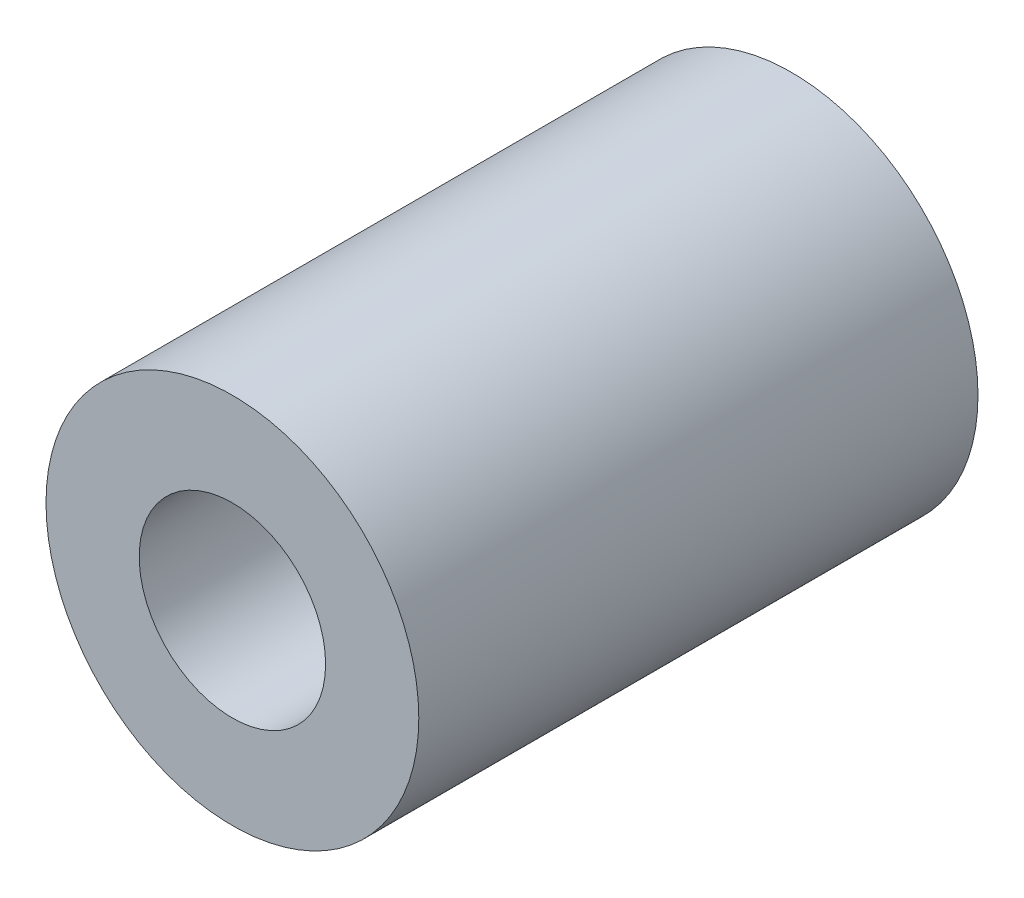
ISO-10303-21;
HEADER;
FILE_DESCRIPTION(('STEP AP214'),'2;1');
FILE_NAME('part.step','',(''),(''),'','','');
FILE_SCHEMA(('AUTOMOTIVE_DESIGN { 1 0 10303 214 1 1 1 1 }'));
ENDSEC;
DATA;
#1=APPLICATION_CONTEXT('core data for automotive mechanical design processes');
#2=APPLICATION_PROTOCOL_DEFINITION('international standard','automotive_design',2000,#1);
#3=PRODUCT_CONTEXT('',#1,'mechanical');
#4=PRODUCT('Part','Part','',(#3));
#5=PRODUCT_RELATED_PRODUCT_CATEGORY('part','',(#4));
#6=PRODUCT_DEFINITION_FORMATION('','',#4);
#7=PRODUCT_DEFINITION_CONTEXT('part definition',#1,'design');
#8=PRODUCT_DEFINITION('design','',#6,#7);
#9=PRODUCT_DEFINITION_SHAPE('','',#8);
#10=(LENGTH_UNIT() NAMED_UNIT(*) SI_UNIT(.MILLI.,.METRE.));
#11=(NAMED_UNIT(*) PLANE_ANGLE_UNIT() SI_UNIT($,.RADIAN.));
#12=(NAMED_UNIT(*) SI_UNIT($,.STERADIAN.) SOLID_ANGLE_UNIT());
#13=UNCERTAINTY_MEASURE_WITH_UNIT(LENGTH_MEASURE(1.E-05),#10,'distance_accuracy_value','');
#14=(GEOMETRIC_REPRESENTATION_CONTEXT(3) GLOBAL_UNCERTAINTY_ASSIGNED_CONTEXT((#13)) GLOBAL_UNIT_ASSIGNED_CONTEXT((#10,
#11,#12)) REPRESENTATION_CONTEXT('',''));
#15=CARTESIAN_POINT('',(0.,0.,0.));
#16=DIRECTION('',(0.,0.,1.));
#17=DIRECTION('',(1.,0.,0.));
#18=AXIS2_PLACEMENT_3D('',#15,#16,#17);
#19=CARTESIAN_POINT('',(0.,0.,9.));
#20=DIRECTION('',(0.,0.,1.));
#21=DIRECTION('',(1.,0.,0.));
#22=AXIS2_PLACEMENT_3D('',#19,#20,#21);
#23=PLANE('',#22);
#24=CARTESIAN_POINT('',(0.,0.,9.));
#25=DIRECTION('',(0.,0.,1.));
#26=DIRECTION('',(1.,0.,0.));
#27=AXIS2_PLACEMENT_3D('',#24,#25,#26);
#28=CIRCLE('',#27,3.);
#29=CARTESIAN_POINT('',(3.,0.,9.));
#30=VERTEX_POINT('',#29);
#31=EDGE_CURVE('E10',#30,#30,#28,.T.);
#32=ORIENTED_EDGE('',*,*,#31,.T.);
#33=EDGE_LOOP('',(#32));
#34=FACE_BOUND('',#33,.T.);
#35=CARTESIAN_POINT('',(0.,0.,9.));
#36=DIRECTION('',(0.,0.,1.));
#37=DIRECTION('',(1.,0.,0.));
#38=AXIS2_PLACEMENT_3D('',#35,#36,#37);
#39=CIRCLE('',#38,1.5);
#40=CARTESIAN_POINT('',(1.5,0.,9.));
#41=VERTEX_POINT('',#40);
#42=EDGE_CURVE('E54',#41,#41,#39,.T.);
#43=ORIENTED_EDGE('',*,*,#42,.F.);
#44=EDGE_LOOP('',(#43));
#45=FACE_BOUND('',#44,.T.);
#46=ADVANCED_FACE('F41',(#34,#45),#23,.T.);
#47=CARTESIAN_POINT('',(0.,0.,0.));
#48=DIRECTION('',(0.,0.,1.));
#49=DIRECTION('',(1.,0.,0.));
#50=AXIS2_PLACEMENT_3D('',#47,#48,#49);
#51=PLANE('',#50);
#52=CARTESIAN_POINT('',(0.,0.,0.));
#53=DIRECTION('',(0.,0.,1.));
#54=DIRECTION('',(1.,0.,0.));
#55=AXIS2_PLACEMENT_3D('',#52,#53,#54);
#56=CIRCLE('',#55,3.);
#57=CARTESIAN_POINT('',(3.,0.,0.));
#58=VERTEX_POINT('',#57);
#59=EDGE_CURVE('E45',#58,#58,#56,.T.);
#60=ORIENTED_EDGE('',*,*,#59,.F.);
#61=EDGE_LOOP('',(#60));
#62=FACE_BOUND('',#61,.T.);
#63=CARTESIAN_POINT('',(0.,0.,0.));
#64=DIRECTION('',(0.,0.,1.));
#65=DIRECTION('',(1.,0.,0.));
#66=AXIS2_PLACEMENT_3D('',#63,#64,#65);
#67=CIRCLE('',#66,1.5);
#68=CARTESIAN_POINT('',(1.5,0.,0.));
#69=VERTEX_POINT('',#68);
#70=EDGE_CURVE('E56',#69,#69,#67,.T.);
#71=ORIENTED_EDGE('',*,*,#70,.T.);
#72=EDGE_LOOP('',(#71));
#73=FACE_BOUND('',#72,.T.);
#74=ADVANCED_FACE('F68',(#62,#73),#51,.F.);
#75=CARTESIAN_POINT('',(0.,0.,9.));
#76=DIRECTION('',(0.,0.,-1.));
#77=DIRECTION('',(-1.,0.,0.));
#78=AXIS2_PLACEMENT_3D('',#75,#76,#77);
#79=CYLINDRICAL_SURFACE('',#78,3.);
#80=ORIENTED_EDGE('',*,*,#31,.F.);
#81=EDGE_LOOP('',(#80));
#82=FACE_BOUND('',#81,.T.);
#83=ORIENTED_EDGE('',*,*,#59,.T.);
#84=EDGE_LOOP('',(#83));
#85=FACE_BOUND('',#84,.T.);
#86=ADVANCED_FACE('F43',(#82,#85),#79,.T.);
#87=CARTESIAN_POINT('',(0.,0.,9.));
#88=DIRECTION('',(0.,0.,-1.));
#89=DIRECTION('',(-1.,0.,0.));
#90=AXIS2_PLACEMENT_3D('',#87,#88,#89);
#91=CYLINDRICAL_SURFACE('',#90,1.5);
#92=ORIENTED_EDGE('',*,*,#42,.T.);
#93=EDGE_LOOP('',(#92));
#94=FACE_BOUND('',#93,.T.);
#95=ORIENTED_EDGE('',*,*,#70,.F.);
#96=EDGE_LOOP('',(#95));
#97=FACE_BOUND('',#96,.T.);
#98=ADVANCED_FACE('F64',(#94,#97),#91,.F.);
#99=CLOSED_SHELL('',(#46,#74,#86,#98));
#100=MANIFOLD_SOLID_BREP('B2',#99);
#101=ADVANCED_BREP_SHAPE_REPRESENTATION('',(#18,#100),#14);
#102=SHAPE_DEFINITION_REPRESENTATION(#9,#101);
ENDSEC;
END-ISO-10303-21;
